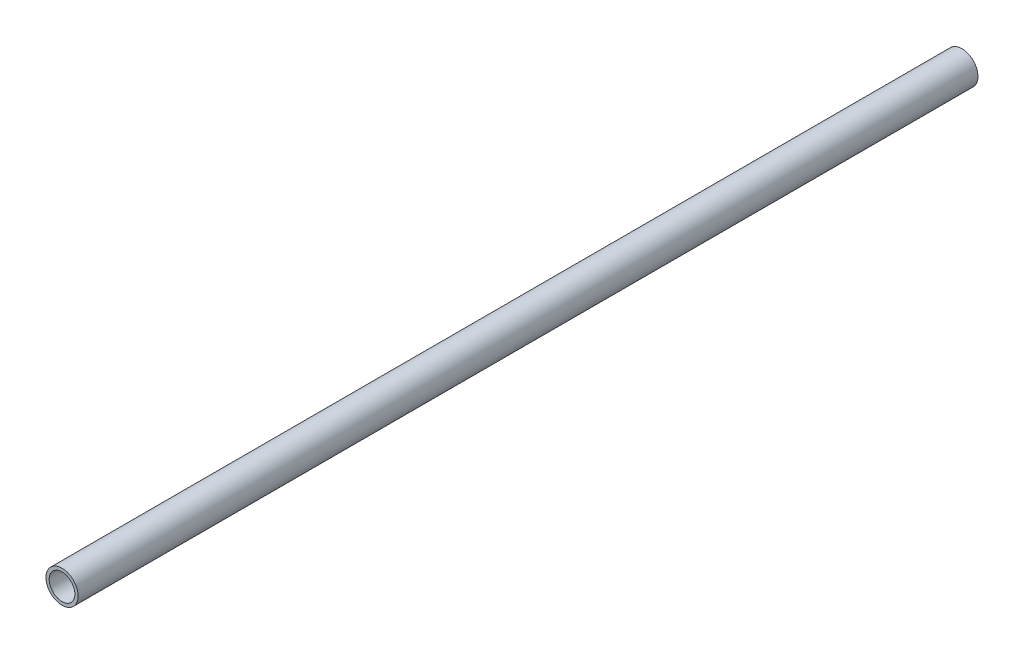
ISO-10303-21;
HEADER;
FILE_DESCRIPTION(('STEP AP214'),'2;1');
FILE_NAME('part.step','',(''),(''),'','','');
FILE_SCHEMA(('AUTOMOTIVE_DESIGN { 1 0 10303 214 1 1 1 1 }'));
ENDSEC;
DATA;
#1=APPLICATION_CONTEXT('core data for automotive mechanical design processes');
#2=APPLICATION_PROTOCOL_DEFINITION('international standard','automotive_design',2000,#1);
#3=PRODUCT_CONTEXT('',#1,'mechanical');
#4=PRODUCT('Part','Part','',(#3));
#5=PRODUCT_RELATED_PRODUCT_CATEGORY('part','',(#4));
#6=PRODUCT_DEFINITION_FORMATION('','',#4);
#7=PRODUCT_DEFINITION_CONTEXT('part definition',#1,'design');
#8=PRODUCT_DEFINITION('design','',#6,#7);
#9=PRODUCT_DEFINITION_SHAPE('','',#8);
#10=(LENGTH_UNIT() NAMED_UNIT(*) SI_UNIT(.MILLI.,.METRE.));
#11=(NAMED_UNIT(*) PLANE_ANGLE_UNIT() SI_UNIT($,.RADIAN.));
#12=(NAMED_UNIT(*) SI_UNIT($,.STERADIAN.) SOLID_ANGLE_UNIT());
#13=UNCERTAINTY_MEASURE_WITH_UNIT(LENGTH_MEASURE(1.E-05),#10,'distance_accuracy_value','');
#14=(GEOMETRIC_REPRESENTATION_CONTEXT(3) GLOBAL_UNCERTAINTY_ASSIGNED_CONTEXT((#13)) GLOBAL_UNIT_ASSIGNED_CONTEXT((#10,
#11,#12)) REPRESENTATION_CONTEXT('',''));
#15=CARTESIAN_POINT('',(0.,0.,0.));
#16=DIRECTION('',(0.,0.,1.));
#17=DIRECTION('',(1.,0.,0.));
#18=AXIS2_PLACEMENT_3D('',#15,#16,#17);
#19=CARTESIAN_POINT('',(0.,0.,280.));
#20=DIRECTION('',(0.,0.,1.));
#21=DIRECTION('',(1.,0.,0.));
#22=AXIS2_PLACEMENT_3D('',#19,#20,#21);
#23=PLANE('',#22);
#24=CARTESIAN_POINT('',(0.,0.,280.));
#25=DIRECTION('',(0.,0.,1.));
#26=DIRECTION('',(1.,0.,0.));
#27=AXIS2_PLACEMENT_3D('',#24,#25,#26);
#28=CIRCLE('',#27,4.);
#29=CARTESIAN_POINT('',(-4.,0.,280.));
#30=VERTEX_POINT('',#29);
#31=EDGE_CURVE('E47',#30,#30,#28,.F.);
#32=ORIENTED_EDGE('',*,*,#31,.T.);
#33=EDGE_LOOP('',(#32));
#34=FACE_BOUND('',#33,.T.);
#35=CARTESIAN_POINT('',(0.,0.,280.));
#36=DIRECTION('',(0.,0.,1.));
#37=DIRECTION('',(1.,0.,0.));
#38=AXIS2_PLACEMENT_3D('',#35,#36,#37);
#39=CIRCLE('',#38,5.);
#40=CARTESIAN_POINT('',(5.,0.,280.));
#41=VERTEX_POINT('',#40);
#42=EDGE_CURVE('E11',#41,#41,#39,.T.);
#43=ORIENTED_EDGE('',*,*,#42,.T.);
#44=EDGE_LOOP('',(#43));
#45=FACE_BOUND('',#44,.T.);
#46=ADVANCED_FACE('F34',(#34,#45),#23,.T.);
#47=CARTESIAN_POINT('',(0.,0.,0.));
#48=DIRECTION('',(0.,0.,1.));
#49=DIRECTION('',(1.,0.,0.));
#50=AXIS2_PLACEMENT_3D('',#47,#48,#49);
#51=PLANE('',#50);
#52=CARTESIAN_POINT('',(0.,0.,0.));
#53=DIRECTION('',(0.,0.,1.));
#54=DIRECTION('',(1.,0.,0.));
#55=AXIS2_PLACEMENT_3D('',#52,#53,#54);
#56=CIRCLE('',#55,4.);
#57=CARTESIAN_POINT('',(-4.,0.,0.));
#58=VERTEX_POINT('',#57);
#59=EDGE_CURVE('E99',#58,#58,#56,.T.);
#60=ORIENTED_EDGE('',*,*,#59,.T.);
#61=EDGE_LOOP('',(#60));
#62=FACE_BOUND('',#61,.T.);
#63=CARTESIAN_POINT('',(0.,0.,0.));
#64=DIRECTION('',(0.,0.,1.));
#65=DIRECTION('',(1.,0.,0.));
#66=AXIS2_PLACEMENT_3D('',#63,#64,#65);
#67=CIRCLE('',#66,5.);
#68=CARTESIAN_POINT('',(5.,0.,0.));
#69=VERTEX_POINT('',#68);
#70=EDGE_CURVE('E42',#69,#69,#67,.T.);
#71=ORIENTED_EDGE('',*,*,#70,.F.);
#72=EDGE_LOOP('',(#71));
#73=FACE_BOUND('',#72,.T.);
#74=ADVANCED_FACE('F66',(#62,#73),#51,.F.);
#75=CARTESIAN_POINT('',(0.,0.,0.));
#76=DIRECTION('',(0.,0.,1.));
#77=DIRECTION('',(1.,0.,0.));
#78=AXIS2_PLACEMENT_3D('',#75,#76,#77);
#79=CYLINDRICAL_SURFACE('',#78,5.);
#80=ORIENTED_EDGE('',*,*,#42,.F.);
#81=EDGE_LOOP('',(#80));
#82=FACE_BOUND('',#81,.T.);
#83=ORIENTED_EDGE('',*,*,#70,.T.);
#84=EDGE_LOOP('',(#83));
#85=FACE_BOUND('',#84,.T.);
#86=ADVANCED_FACE('F75',(#82,#85),#79,.T.);
#87=CARTESIAN_POINT('',(0.,0.,326.));
#88=DIRECTION('',(0.,0.,-1.));
#89=DIRECTION('',(-1.,0.,0.));
#90=AXIS2_PLACEMENT_3D('',#87,#88,#89);
#91=CYLINDRICAL_SURFACE('',#90,4.);
#92=CARTESIAN_POINT('',(-4.,0.,280.));
#93=CARTESIAN_POINT('',(-4.,0.,277.083333333333));
#94=CARTESIAN_POINT('',(-4.,0.,274.166666666667));
#95=CARTESIAN_POINT('',(-4.,0.,268.333333333333));
#96=CARTESIAN_POINT('',(-4.,0.,265.416666666667));
#97=CARTESIAN_POINT('',(-4.,0.,259.583333333333));
#98=CARTESIAN_POINT('',(-4.,0.,256.666666666667));
#99=CARTESIAN_POINT('',(-4.,0.,250.833333333333));
#100=CARTESIAN_POINT('',(-4.,0.,247.916666666667));
#101=CARTESIAN_POINT('',(-4.,0.,242.083333333333));
#102=CARTESIAN_POINT('',(-4.,0.,239.166666666667));
#103=CARTESIAN_POINT('',(-4.,0.,233.333333333333));
#104=CARTESIAN_POINT('',(-4.,0.,230.416666666667));
#105=CARTESIAN_POINT('',(-4.,0.,224.583333333333));
#106=CARTESIAN_POINT('',(-4.,0.,221.666666666667));
#107=CARTESIAN_POINT('',(-4.,0.,215.833333333333));
#108=CARTESIAN_POINT('',(-4.,0.,212.916666666667));
#109=CARTESIAN_POINT('',(-4.,0.,207.083333333333));
#110=CARTESIAN_POINT('',(-4.,0.,204.166666666667));
#111=CARTESIAN_POINT('',(-4.,0.,198.333333333333));
#112=CARTESIAN_POINT('',(-4.,0.,195.416666666667));
#113=CARTESIAN_POINT('',(-4.,0.,189.583333333333));
#114=CARTESIAN_POINT('',(-4.,0.,186.666666666667));
#115=CARTESIAN_POINT('',(-4.,0.,180.833333333333));
#116=CARTESIAN_POINT('',(-4.,0.,177.916666666667));
#117=CARTESIAN_POINT('',(-4.,0.,172.083333333333));
#118=CARTESIAN_POINT('',(-4.,0.,169.166666666667));
#119=CARTESIAN_POINT('',(-4.,0.,163.333333333333));
#120=CARTESIAN_POINT('',(-4.,0.,160.416666666667));
#121=CARTESIAN_POINT('',(-4.,0.,154.583333333333));
#122=CARTESIAN_POINT('',(-4.,0.,151.666666666667));
#123=CARTESIAN_POINT('',(-4.,0.,145.833333333333));
#124=CARTESIAN_POINT('',(-4.,0.,142.916666666667));
#125=CARTESIAN_POINT('',(-4.,0.,137.083333333333));
#126=CARTESIAN_POINT('',(-4.,0.,134.166666666667));
#127=CARTESIAN_POINT('',(-4.,0.,128.333333333333));
#128=CARTESIAN_POINT('',(-4.,0.,125.416666666667));
#129=CARTESIAN_POINT('',(-4.,0.,119.583333333333));
#130=CARTESIAN_POINT('',(-4.,0.,116.666666666667));
#131=CARTESIAN_POINT('',(-4.,0.,110.833333333333));
#132=CARTESIAN_POINT('',(-4.,0.,107.916666666667));
#133=CARTESIAN_POINT('',(-4.,0.,102.083333333333));
#134=CARTESIAN_POINT('',(-4.,0.,99.1666666666666));
#135=CARTESIAN_POINT('',(-4.,0.,93.3333333333333));
#136=CARTESIAN_POINT('',(-4.,0.,90.4166666666666));
#137=CARTESIAN_POINT('',(-4.,0.,84.5833333333333));
#138=CARTESIAN_POINT('',(-4.,0.,81.6666666666666));
#139=CARTESIAN_POINT('',(-4.,0.,75.8333333333333));
#140=CARTESIAN_POINT('',(-4.,0.,72.9166666666666));
#141=CARTESIAN_POINT('',(-4.,0.,67.0833333333333));
#142=CARTESIAN_POINT('',(-4.,0.,64.1666666666666));
#143=CARTESIAN_POINT('',(-4.,0.,58.3333333333333));
#144=CARTESIAN_POINT('',(-4.,0.,55.4166666666667));
#145=CARTESIAN_POINT('',(-4.,0.,49.5833333333333));
#146=CARTESIAN_POINT('',(-4.,0.,46.6666666666666));
#147=CARTESIAN_POINT('',(-4.,0.,40.8333333333333));
#148=CARTESIAN_POINT('',(-4.,0.,37.9166666666666));
#149=CARTESIAN_POINT('',(-4.,0.,32.0833333333333));
#150=CARTESIAN_POINT('',(-4.,0.,29.1666666666666));
#151=CARTESIAN_POINT('',(-4.,0.,23.3333333333333));
#152=CARTESIAN_POINT('',(-4.,0.,20.4166666666666));
#153=CARTESIAN_POINT('',(-4.,0.,14.5833333333333));
#154=CARTESIAN_POINT('',(-4.,0.,11.6666666666666));
#155=CARTESIAN_POINT('',(-4.,0.,5.83333333333326));
#156=CARTESIAN_POINT('',(-4.,0.,2.9166666666666));
#157=CARTESIAN_POINT('',(-4.,0.,0.));
#158=B_SPLINE_CURVE_WITH_KNOTS('',3,(#92,#93,#94,#95,#96,#97,#98,#99,#100,#101,#102,#103,#104,
#105,#106,#107,#108,#109,#110,#111,#112,#113,#114,#115,#116,#117,#118,#119,#120,#121,#122,#123,
#124,#125,#126,#127,#128,#129,#130,#131,#132,#133,#134,#135,#136,#137,#138,#139,#140,#141,#142,
#143,#144,#145,#146,#147,#148,#149,#150,#151,#152,#153,#154,#155,#156,#157),.UNSPECIFIED.,.F.,
.F.,(4,2,2,2,2,2,2,2,2,2,2,2,2,2,2,2,2,2,2,2,2,2,2,2,2,2,2,2,2,2,2,2,4),(0.,8.74999999999998,
17.5,26.25,35.,43.75,52.5,61.25,70.,78.75,87.5,96.25,105.,113.75,122.5,131.25,140.,148.75,157.5,
166.25,175.,183.75,192.5,201.25,210.,218.75,227.5,236.25,245.,253.75,262.5,271.25,280.),.UNSPECIFIED.);
#159=EDGE_CURVE('BSEAM77',#30,#58,#158,.T.);
#160=ORIENTED_EDGE('',*,*,#31,.F.);
#161=ORIENTED_EDGE('',*,*,#59,.F.);
#162=ORIENTED_EDGE('',*,*,#159,.T.);
#163=ORIENTED_EDGE('',*,*,#159,.F.);
#164=EDGE_LOOP('',(#160,#162,#161,#163));
#165=FACE_BOUND('',#164,.T.);
#166=ADVANCED_FACE('F77',(#165),#91,.F.);
#167=CLOSED_SHELL('',(#46,#74,#86,#166));
#168=MANIFOLD_SOLID_BREP('B2',#167);
#169=ADVANCED_BREP_SHAPE_REPRESENTATION('',(#18,#168),#14);
#170=SHAPE_DEFINITION_REPRESENTATION(#9,#169);
ENDSEC;
END-ISO-10303-21;
